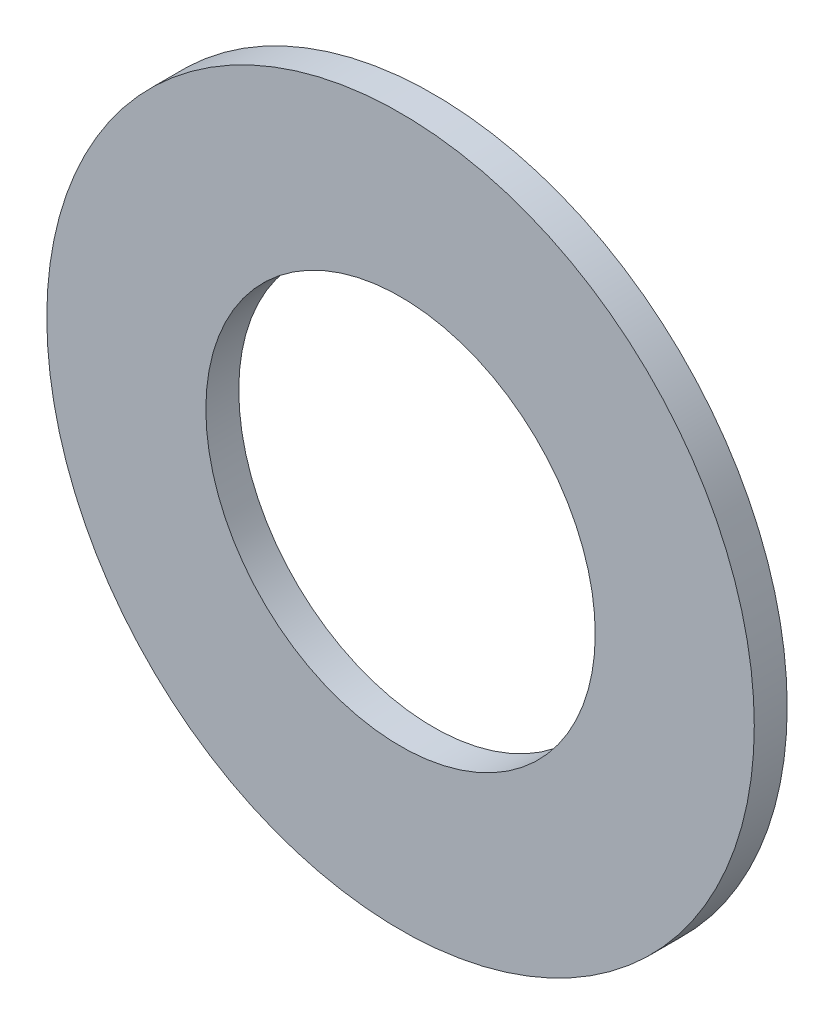
ISO-10303-21;
HEADER;
FILE_DESCRIPTION(('STEP AP214'),'2;1');
FILE_NAME('part.step','',(''),(''),'','','');
FILE_SCHEMA(('AUTOMOTIVE_DESIGN { 1 0 10303 214 1 1 1 1 }'));
ENDSEC;
DATA;
#1=APPLICATION_CONTEXT('core data for automotive mechanical design processes');
#2=APPLICATION_PROTOCOL_DEFINITION('international standard','automotive_design',2000,#1);
#3=PRODUCT_CONTEXT('',#1,'mechanical');
#4=PRODUCT('Part','Part','',(#3));
#5=PRODUCT_RELATED_PRODUCT_CATEGORY('part','',(#4));
#6=PRODUCT_DEFINITION_FORMATION('','',#4);
#7=PRODUCT_DEFINITION_CONTEXT('part definition',#1,'design');
#8=PRODUCT_DEFINITION('design','',#6,#7);
#9=PRODUCT_DEFINITION_SHAPE('','',#8);
#10=(LENGTH_UNIT() NAMED_UNIT(*) SI_UNIT(.MILLI.,.METRE.));
#11=(NAMED_UNIT(*) PLANE_ANGLE_UNIT() SI_UNIT($,.RADIAN.));
#12=(NAMED_UNIT(*) SI_UNIT($,.STERADIAN.) SOLID_ANGLE_UNIT());
#13=UNCERTAINTY_MEASURE_WITH_UNIT(LENGTH_MEASURE(1.E-05),#10,'distance_accuracy_value','');
#14=(GEOMETRIC_REPRESENTATION_CONTEXT(3) GLOBAL_UNCERTAINTY_ASSIGNED_CONTEXT((#13)) GLOBAL_UNIT_ASSIGNED_CONTEXT((#10,
#11,#12)) REPRESENTATION_CONTEXT('',''));
#15=CARTESIAN_POINT('',(0.,0.,0.));
#16=DIRECTION('',(0.,0.,1.));
#17=DIRECTION('',(1.,0.,0.));
#18=AXIS2_PLACEMENT_3D('',#15,#16,#17);
#19=CARTESIAN_POINT('',(0.,0.,3.));
#20=DIRECTION('',(0.,0.,-1.));
#21=DIRECTION('',(-1.,0.,0.));
#22=AXIS2_PLACEMENT_3D('',#19,#20,#21);
#23=CYLINDRICAL_SURFACE('',#22,32.25);
#24=CARTESIAN_POINT('',(0.,0.,3.));
#25=DIRECTION('',(0.,0.,1.));
#26=DIRECTION('',(1.,0.,0.));
#27=AXIS2_PLACEMENT_3D('',#24,#25,#26);
#28=CIRCLE('',#27,32.25);
#29=CARTESIAN_POINT('',(32.25,0.,3.));
#30=VERTEX_POINT('',#29);
#31=EDGE_CURVE('E10',#30,#30,#28,.T.);
#32=ORIENTED_EDGE('',*,*,#31,.F.);
#33=EDGE_LOOP('',(#32));
#34=FACE_BOUND('',#33,.T.);
#35=CARTESIAN_POINT('',(0.,0.,0.));
#36=DIRECTION('',(0.,0.,1.));
#37=DIRECTION('',(1.,0.,0.));
#38=AXIS2_PLACEMENT_3D('',#35,#36,#37);
#39=CIRCLE('',#38,32.25);
#40=CARTESIAN_POINT('',(32.25,0.,0.));
#41=VERTEX_POINT('',#40);
#42=EDGE_CURVE('E40',#41,#41,#39,.T.);
#43=ORIENTED_EDGE('',*,*,#42,.T.);
#44=EDGE_LOOP('',(#43));
#45=FACE_BOUND('',#44,.T.);
#46=ADVANCED_FACE('F37',(#34,#45),#23,.T.);
#47=CARTESIAN_POINT('',(0.,0.,3.));
#48=DIRECTION('',(0.,0.,1.));
#49=DIRECTION('',(1.,0.,0.));
#50=AXIS2_PLACEMENT_3D('',#47,#48,#49);
#51=PLANE('',#50);
#52=CARTESIAN_POINT('',(0.,0.,3.));
#53=DIRECTION('',(0.,0.,-1.));
#54=DIRECTION('',(-1.,0.,0.));
#55=AXIS2_PLACEMENT_3D('',#52,#53,#54);
#56=CIRCLE('',#55,17.75);
#57=CARTESIAN_POINT('',(-17.75,0.,3.));
#58=VERTEX_POINT('',#57);
#59=EDGE_CURVE('E49',#58,#58,#56,.T.);
#60=ORIENTED_EDGE('',*,*,#59,.T.);
#61=EDGE_LOOP('',(#60));
#62=FACE_BOUND('',#61,.T.);
#63=ORIENTED_EDGE('',*,*,#31,.T.);
#64=EDGE_LOOP('',(#63));
#65=FACE_BOUND('',#64,.T.);
#66=ADVANCED_FACE('F59',(#62,#65),#51,.T.);
#67=CARTESIAN_POINT('',(0.,0.,0.));
#68=DIRECTION('',(0.,0.,1.));
#69=DIRECTION('',(1.,0.,0.));
#70=AXIS2_PLACEMENT_3D('',#67,#68,#69);
#71=PLANE('',#70);
#72=CARTESIAN_POINT('',(0.,0.,0.));
#73=DIRECTION('',(0.,0.,-1.));
#74=DIRECTION('',(-1.,0.,0.));
#75=AXIS2_PLACEMENT_3D('',#72,#73,#74);
#76=CIRCLE('',#75,17.75);
#77=CARTESIAN_POINT('',(-17.75,0.,0.));
#78=VERTEX_POINT('',#77);
#79=EDGE_CURVE('E51',#78,#78,#76,.T.);
#80=ORIENTED_EDGE('',*,*,#79,.F.);
#81=EDGE_LOOP('',(#80));
#82=FACE_BOUND('',#81,.T.);
#83=ORIENTED_EDGE('',*,*,#42,.F.);
#84=EDGE_LOOP('',(#83));
#85=FACE_BOUND('',#84,.T.);
#86=ADVANCED_FACE('F64',(#82,#85),#71,.F.);
#87=CARTESIAN_POINT('',(0.,0.,3.));
#88=DIRECTION('',(0.,0.,-1.));
#89=DIRECTION('',(-1.,0.,0.));
#90=AXIS2_PLACEMENT_3D('',#87,#88,#89);
#91=CYLINDRICAL_SURFACE('',#90,17.75);
#92=ORIENTED_EDGE('',*,*,#59,.F.);
#93=EDGE_LOOP('',(#92));
#94=FACE_BOUND('',#93,.T.);
#95=ORIENTED_EDGE('',*,*,#79,.T.);
#96=EDGE_LOOP('',(#95));
#97=FACE_BOUND('',#96,.T.);
#98=ADVANCED_FACE('F61',(#94,#97),#91,.F.);
#99=CLOSED_SHELL('',(#46,#66,#86,#98));
#100=MANIFOLD_SOLID_BREP('B2',#99);
#101=ADVANCED_BREP_SHAPE_REPRESENTATION('',(#18,#100),#14);
#102=SHAPE_DEFINITION_REPRESENTATION(#9,#101);
ENDSEC;
END-ISO-10303-21;
